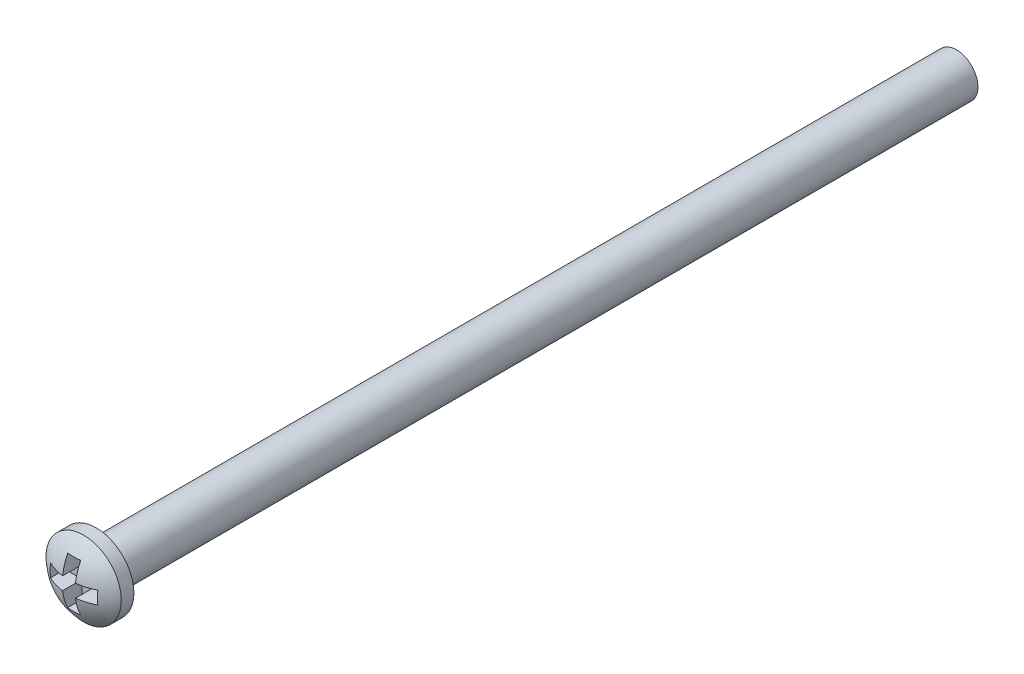
ISO-10303-21;
HEADER;
FILE_DESCRIPTION(('STEP AP214'),'2;1');
FILE_NAME('part.step','',(''),(''),'','','');
FILE_SCHEMA(('AUTOMOTIVE_DESIGN { 1 0 10303 214 1 1 1 1 }'));
ENDSEC;
DATA;
#1=APPLICATION_CONTEXT('core data for automotive mechanical design processes');
#2=APPLICATION_PROTOCOL_DEFINITION('international standard','automotive_design',2000,#1);
#3=PRODUCT_CONTEXT('',#1,'mechanical');
#4=PRODUCT('Part','Part','',(#3));
#5=PRODUCT_RELATED_PRODUCT_CATEGORY('part','',(#4));
#6=PRODUCT_DEFINITION_FORMATION('','',#4);
#7=PRODUCT_DEFINITION_CONTEXT('part definition',#1,'design');
#8=PRODUCT_DEFINITION('design','',#6,#7);
#9=PRODUCT_DEFINITION_SHAPE('','',#8);
#10=(LENGTH_UNIT() NAMED_UNIT(*) SI_UNIT(.MILLI.,.METRE.));
#11=(NAMED_UNIT(*) PLANE_ANGLE_UNIT() SI_UNIT($,.RADIAN.));
#12=(NAMED_UNIT(*) SI_UNIT($,.STERADIAN.) SOLID_ANGLE_UNIT());
#13=UNCERTAINTY_MEASURE_WITH_UNIT(LENGTH_MEASURE(1.E-05),#10,'distance_accuracy_value','');
#14=(GEOMETRIC_REPRESENTATION_CONTEXT(3) GLOBAL_UNCERTAINTY_ASSIGNED_CONTEXT((#13)) GLOBAL_UNIT_ASSIGNED_CONTEXT((#10,
#11,#12)) REPRESENTATION_CONTEXT('',''));
#15=CARTESIAN_POINT('',(0.,0.,0.));
#16=DIRECTION('',(0.,0.,1.));
#17=DIRECTION('',(1.,0.,0.));
#18=AXIS2_PLACEMENT_3D('',#15,#16,#17);
#19=CARTESIAN_POINT('',(0.,0.,-40.));
#20=DIRECTION('',(0.,0.,1.));
#21=DIRECTION('',(1.,0.,0.));
#22=AXIS2_PLACEMENT_3D('',#19,#20,#21);
#23=CYLINDRICAL_SURFACE('',#22,1.);
#24=CARTESIAN_POINT('',(0.,0.,-40.));
#25=DIRECTION('',(0.,0.,1.));
#26=DIRECTION('',(1.,0.,0.));
#27=AXIS2_PLACEMENT_3D('',#24,#25,#26);
#28=CIRCLE('',#27,1.);
#29=CARTESIAN_POINT('',(1.,0.,-40.));
#30=VERTEX_POINT('',#29);
#31=EDGE_CURVE('E212',#30,#30,#28,.T.);
#32=ORIENTED_EDGE('',*,*,#31,.T.);
#33=EDGE_LOOP('',(#32));
#34=FACE_BOUND('',#33,.T.);
#35=CARTESIAN_POINT('',(0.,0.,0.));
#36=DIRECTION('',(0.,0.,1.));
#37=DIRECTION('',(1.,0.,0.));
#38=AXIS2_PLACEMENT_3D('',#35,#36,#37);
#39=CIRCLE('',#38,1.);
#40=CARTESIAN_POINT('',(1.,0.,0.));
#41=VERTEX_POINT('',#40);
#42=EDGE_CURVE('E208',#41,#41,#39,.T.);
#43=ORIENTED_EDGE('',*,*,#42,.F.);
#44=EDGE_LOOP('',(#43));
#45=FACE_BOUND('',#44,.T.);
#46=ADVANCED_FACE('F41',(#34,#45),#23,.T.);
#47=CARTESIAN_POINT('',(0.,0.,-40.));
#48=DIRECTION('',(0.,0.,1.));
#49=DIRECTION('',(1.,0.,0.));
#50=AXIS2_PLACEMENT_3D('',#47,#48,#49);
#51=PLANE('',#50);
#52=ORIENTED_EDGE('',*,*,#31,.F.);
#53=EDGE_LOOP('',(#52));
#54=FACE_BOUND('',#53,.T.);
#55=ADVANCED_FACE('F281',(#54),#51,.F.);
#56=CARTESIAN_POINT('',(0.,0.,0.));
#57=DIRECTION('',(0.,0.,1.));
#58=DIRECTION('',(1.,0.,0.));
#59=AXIS2_PLACEMENT_3D('',#56,#57,#58);
#60=PLANE('',#59);
#61=ORIENTED_EDGE('',*,*,#42,.T.);
#62=EDGE_LOOP('',(#61));
#63=FACE_BOUND('',#62,.T.);
#64=CARTESIAN_POINT('',(0.,0.,0.));
#65=DIRECTION('',(0.,0.,-1.));
#66=DIRECTION('',(-1.,0.,0.));
#67=AXIS2_PLACEMENT_3D('',#64,#65,#66);
#68=CIRCLE('',#67,1.75);
#69=CARTESIAN_POINT('',(-1.75,0.,0.));
#70=VERTEX_POINT('',#69);
#71=EDGE_CURVE('E210',#70,#70,#68,.T.);
#72=ORIENTED_EDGE('',*,*,#71,.T.);
#73=EDGE_LOOP('',(#72));
#74=FACE_BOUND('',#73,.T.);
#75=ADVANCED_FACE('F286',(#63,#74),#60,.F.);
#76=CARTESIAN_POINT('',(0.,0.,-2.));
#77=DIRECTION('',(0.,0.,-1.));
#78=DIRECTION('',(-1.,0.,0.));
#79=AXIS2_PLACEMENT_3D('',#76,#77,#78);
#80=CYLINDRICAL_SURFACE('',#79,1.75);
#81=ORIENTED_EDGE('',*,*,#71,.F.);
#82=EDGE_LOOP('',(#81));
#83=FACE_BOUND('',#82,.T.);
#84=CARTESIAN_POINT('',(0.,0.,0.585357107135713));
#85=DIRECTION('',(0.,0.,-1.));
#86=DIRECTION('',(-1.,0.,0.));
#87=AXIS2_PLACEMENT_3D('',#84,#85,#86);
#88=CIRCLE('',#87,1.75);
#89=CARTESIAN_POINT('',(-1.75,0.,0.585357107135713));
#90=VERTEX_POINT('',#89);
#91=EDGE_CURVE('E180',#90,#90,#88,.T.);
#92=ORIENTED_EDGE('',*,*,#91,.T.);
#93=EDGE_LOOP('',(#92));
#94=FACE_BOUND('',#93,.T.);
#95=ADVANCED_FACE('F300',(#83,#94),#80,.T.);
#96=CARTESIAN_POINT('',(0.,0.,-1.2));
#97=DIRECTION('',(0.,0.,-1.));
#98=DIRECTION('',(1.,0.,0.));
#99=AXIS2_PLACEMENT_3D('',#96,#97,#98);
#100=SPHERICAL_SURFACE('',#99,2.5);
#101=CARTESIAN_POINT('',(0.,-1.1,-1.2));
#102=DIRECTION('',(0.,-1.,0.));
#103=DIRECTION('',(0.,0.,-1.));
#104=AXIS2_PLACEMENT_3D('',#101,#102,#103);
#105=CIRCLE('',#104,2.24499443206437);
#106=CARTESIAN_POINT('',(0.3,-1.1,1.0248595461287));
#107=VERTEX_POINT('',#106);
#108=CARTESIAN_POINT('',(-0.3,-1.1,1.0248595461287));
#109=VERTEX_POINT('',#108);
#110=EDGE_CURVE('E211',#107,#109,#105,.T.);
#111=ORIENTED_EDGE('',*,*,#110,.T.);
#112=CARTESIAN_POINT('',(-0.3,0.,-1.2));
#113=DIRECTION('',(-1.,0.,0.));
#114=DIRECTION('',(0.,0.,1.));
#115=AXIS2_PLACEMENT_3D('',#112,#113,#114);
#116=CIRCLE('',#115,2.48193472919818);
#117=CARTESIAN_POINT('',(-0.3,-0.3,1.26373699895098));
#118=VERTEX_POINT('',#117);
#119=EDGE_CURVE('E11',#109,#118,#116,.T.);
#120=ORIENTED_EDGE('',*,*,#119,.T.);
#121=CARTESIAN_POINT('',(0.,-0.3,-1.2));
#122=DIRECTION('',(0.,-1.,0.));
#123=DIRECTION('',(0.,0.,-1.));
#124=AXIS2_PLACEMENT_3D('',#121,#122,#123);
#125=CIRCLE('',#124,2.48193472919818);
#126=CARTESIAN_POINT('',(-1.1,-0.3,1.0248595461287));
#127=VERTEX_POINT('',#126);
#128=EDGE_CURVE('E48',#118,#127,#125,.T.);
#129=ORIENTED_EDGE('',*,*,#128,.T.);
#130=CARTESIAN_POINT('',(-1.1,0.,-1.2));
#131=DIRECTION('',(-1.,0.,0.));
#132=DIRECTION('',(0.,0.,1.));
#133=AXIS2_PLACEMENT_3D('',#130,#131,#132);
#134=CIRCLE('',#133,2.24499443206437);
#135=CARTESIAN_POINT('',(-1.1,0.3,1.0248595461287));
#136=VERTEX_POINT('',#135);
#137=EDGE_CURVE('E245',#127,#136,#134,.T.);
#138=ORIENTED_EDGE('',*,*,#137,.T.);
#139=CARTESIAN_POINT('',(0.,0.3,-1.2));
#140=DIRECTION('',(0.,1.,0.));
#141=DIRECTION('',(0.,0.,1.));
#142=AXIS2_PLACEMENT_3D('',#139,#140,#141);
#143=CIRCLE('',#142,2.48193472919818);
#144=CARTESIAN_POINT('',(-0.3,0.3,1.26373699895098));
#145=VERTEX_POINT('',#144);
#146=EDGE_CURVE('E236',#136,#145,#143,.T.);
#147=ORIENTED_EDGE('',*,*,#146,.T.);
#148=CARTESIAN_POINT('',(-0.3,0.,-1.2));
#149=DIRECTION('',(-1.,0.,0.));
#150=DIRECTION('',(0.,0.,1.));
#151=AXIS2_PLACEMENT_3D('',#148,#149,#150);
#152=CIRCLE('',#151,2.48193472919818);
#153=CARTESIAN_POINT('',(-0.3,1.1,1.0248595461287));
#154=VERTEX_POINT('',#153);
#155=EDGE_CURVE('E237',#145,#154,#152,.T.);
#156=ORIENTED_EDGE('',*,*,#155,.T.);
#157=CARTESIAN_POINT('',(0.,1.1,-1.2));
#158=DIRECTION('',(0.,1.,0.));
#159=DIRECTION('',(0.,0.,1.));
#160=AXIS2_PLACEMENT_3D('',#157,#158,#159);
#161=CIRCLE('',#160,2.24499443206437);
#162=CARTESIAN_POINT('',(0.3,1.1,1.0248595461287));
#163=VERTEX_POINT('',#162);
#164=EDGE_CURVE('E231',#154,#163,#161,.T.);
#165=ORIENTED_EDGE('',*,*,#164,.T.);
#166=CARTESIAN_POINT('',(0.3,0.,-1.2));
#167=DIRECTION('',(1.,0.,0.));
#168=DIRECTION('',(0.,0.,-1.));
#169=AXIS2_PLACEMENT_3D('',#166,#167,#168);
#170=CIRCLE('',#169,2.48193472919818);
#171=CARTESIAN_POINT('',(0.3,0.3,1.26373699895098));
#172=VERTEX_POINT('',#171);
#173=EDGE_CURVE('E228',#163,#172,#170,.T.);
#174=ORIENTED_EDGE('',*,*,#173,.T.);
#175=CARTESIAN_POINT('',(0.,0.3,-1.2));
#176=DIRECTION('',(0.,1.,0.));
#177=DIRECTION('',(0.,0.,1.));
#178=AXIS2_PLACEMENT_3D('',#175,#176,#177);
#179=CIRCLE('',#178,2.48193472919818);
#180=CARTESIAN_POINT('',(1.1,0.3,1.0248595461287));
#181=VERTEX_POINT('',#180);
#182=EDGE_CURVE('E230',#172,#181,#179,.T.);
#183=ORIENTED_EDGE('',*,*,#182,.T.);
#184=CARTESIAN_POINT('',(1.1,0.,-1.2));
#185=DIRECTION('',(1.,0.,0.));
#186=DIRECTION('',(0.,0.,-1.));
#187=AXIS2_PLACEMENT_3D('',#184,#185,#186);
#188=CIRCLE('',#187,2.24499443206437);
#189=CARTESIAN_POINT('',(1.1,-0.3,1.0248595461287));
#190=VERTEX_POINT('',#189);
#191=EDGE_CURVE('E224',#181,#190,#188,.T.);
#192=ORIENTED_EDGE('',*,*,#191,.T.);
#193=CARTESIAN_POINT('',(0.,-0.3,-1.2));
#194=DIRECTION('',(0.,-1.,0.));
#195=DIRECTION('',(0.,0.,-1.));
#196=AXIS2_PLACEMENT_3D('',#193,#194,#195);
#197=CIRCLE('',#196,2.48193472919818);
#198=CARTESIAN_POINT('',(0.3,-0.3,1.26373699895098));
#199=VERTEX_POINT('',#198);
#200=EDGE_CURVE('E223',#190,#199,#197,.T.);
#201=ORIENTED_EDGE('',*,*,#200,.T.);
#202=CARTESIAN_POINT('',(0.3,0.,-1.2));
#203=DIRECTION('',(1.,0.,0.));
#204=DIRECTION('',(0.,0.,-1.));
#205=AXIS2_PLACEMENT_3D('',#202,#203,#204);
#206=CIRCLE('',#205,2.48193472919818);
#207=EDGE_CURVE('E219',#199,#107,#206,.T.);
#208=ORIENTED_EDGE('',*,*,#207,.T.);
#209=EDGE_LOOP('',(#111,#120,#129,#138,#147,#156,#165,#174,#183,#192,#201,#208));
#210=FACE_BOUND('',#209,.T.);
#211=ORIENTED_EDGE('',*,*,#91,.F.);
#212=EDGE_LOOP('',(#211));
#213=FACE_BOUND('',#212,.T.);
#214=ADVANCED_FACE('F243',(#210,#213),#100,.T.);
#215=CARTESIAN_POINT('',(-0.3,-0.3,0.35));
#216=DIRECTION('',(-1.,0.,0.));
#217=DIRECTION('',(0.,0.,1.));
#218=AXIS2_PLACEMENT_3D('',#215,#216,#217);
#219=PLANE('',#218);
#220=DIRECTION('',(0.,0.,1.));
#221=VECTOR('',#220,1.);
#222=CARTESIAN_POINT('',(-0.3,-1.1,0.35));
#223=LINE('',#222,#221);
#224=CARTESIAN_POINT('',(-0.3,-1.1,0.35));
#225=VERTEX_POINT('',#224);
#226=EDGE_CURVE('E54',#225,#109,#223,.T.);
#227=ORIENTED_EDGE('',*,*,#226,.F.);
#228=DIRECTION('',(0.,-1.,0.));
#229=VECTOR('',#228,1.);
#230=CARTESIAN_POINT('',(-0.3,-0.3,0.35));
#231=LINE('',#230,#229);
#232=CARTESIAN_POINT('',(-0.3,-0.3,0.35));
#233=VERTEX_POINT('',#232);
#234=EDGE_CURVE('E129',#233,#225,#231,.T.);
#235=ORIENTED_EDGE('',*,*,#234,.F.);
#236=DIRECTION('',(0.,0.,1.));
#237=VECTOR('',#236,1.);
#238=CARTESIAN_POINT('',(-0.3,-0.3,0.35));
#239=LINE('',#238,#237);
#240=EDGE_CURVE('E172',#233,#118,#239,.T.);
#241=ORIENTED_EDGE('',*,*,#240,.T.);
#242=ORIENTED_EDGE('',*,*,#119,.F.);
#243=EDGE_LOOP('',(#227,#235,#241,#242));
#244=FACE_BOUND('',#243,.T.);
#245=ADVANCED_FACE('F127',(#244),#219,.F.);
#246=CARTESIAN_POINT('',(-1.1,-0.3,0.35));
#247=DIRECTION('',(0.,-1.,0.));
#248=DIRECTION('',(0.,0.,-1.));
#249=AXIS2_PLACEMENT_3D('',#246,#247,#248);
#250=PLANE('',#249);
#251=ORIENTED_EDGE('',*,*,#240,.F.);
#252=DIRECTION('',(1.,0.,0.));
#253=VECTOR('',#252,1.);
#254=CARTESIAN_POINT('',(-1.1,-0.3,0.35));
#255=LINE('',#254,#253);
#256=CARTESIAN_POINT('',(-1.1,-0.3,0.35));
#257=VERTEX_POINT('',#256);
#258=EDGE_CURVE('E131',#257,#233,#255,.T.);
#259=ORIENTED_EDGE('',*,*,#258,.F.);
#260=DIRECTION('',(0.,0.,1.));
#261=VECTOR('',#260,1.);
#262=CARTESIAN_POINT('',(-1.1,-0.3,0.35));
#263=LINE('',#262,#261);
#264=EDGE_CURVE('E179',#257,#127,#263,.T.);
#265=ORIENTED_EDGE('',*,*,#264,.T.);
#266=ORIENTED_EDGE('',*,*,#128,.F.);
#267=EDGE_LOOP('',(#251,#259,#265,#266));
#268=FACE_BOUND('',#267,.T.);
#269=ADVANCED_FACE('F273',(#268),#250,.F.);
#270=CARTESIAN_POINT('',(-1.1,0.3,0.35));
#271=DIRECTION('',(-1.,0.,0.));
#272=DIRECTION('',(0.,0.,1.));
#273=AXIS2_PLACEMENT_3D('',#270,#271,#272);
#274=PLANE('',#273);
#275=ORIENTED_EDGE('',*,*,#264,.F.);
#276=DIRECTION('',(0.,-1.,0.));
#277=VECTOR('',#276,1.);
#278=CARTESIAN_POINT('',(-1.1,0.3,0.35));
#279=LINE('',#278,#277);
#280=CARTESIAN_POINT('',(-1.1,0.3,0.35));
#281=VERTEX_POINT('',#280);
#282=EDGE_CURVE('E175',#281,#257,#279,.T.);
#283=ORIENTED_EDGE('',*,*,#282,.F.);
#284=DIRECTION('',(0.,0.,1.));
#285=VECTOR('',#284,1.);
#286=CARTESIAN_POINT('',(-1.1,0.3,0.35));
#287=LINE('',#286,#285);
#288=EDGE_CURVE('E178',#281,#136,#287,.T.);
#289=ORIENTED_EDGE('',*,*,#288,.T.);
#290=ORIENTED_EDGE('',*,*,#137,.F.);
#291=EDGE_LOOP('',(#275,#283,#289,#290));
#292=FACE_BOUND('',#291,.T.);
#293=ADVANCED_FACE('F275',(#292),#274,.F.);
#294=CARTESIAN_POINT('',(-0.3,0.3,0.35));
#295=DIRECTION('',(0.,1.,0.));
#296=DIRECTION('',(0.,0.,1.));
#297=AXIS2_PLACEMENT_3D('',#294,#295,#296);
#298=PLANE('',#297);
#299=ORIENTED_EDGE('',*,*,#288,.F.);
#300=DIRECTION('',(-1.,0.,0.));
#301=VECTOR('',#300,1.);
#302=CARTESIAN_POINT('',(-0.3,0.3,0.35));
#303=LINE('',#302,#301);
#304=CARTESIAN_POINT('',(-0.3,0.3,0.35));
#305=VERTEX_POINT('',#304);
#306=EDGE_CURVE('E166',#305,#281,#303,.T.);
#307=ORIENTED_EDGE('',*,*,#306,.F.);
#308=DIRECTION('',(0.,0.,1.));
#309=VECTOR('',#308,1.);
#310=CARTESIAN_POINT('',(-0.3,0.3,0.35));
#311=LINE('',#310,#309);
#312=EDGE_CURVE('E181',#305,#145,#311,.T.);
#313=ORIENTED_EDGE('',*,*,#312,.T.);
#314=ORIENTED_EDGE('',*,*,#146,.F.);
#315=EDGE_LOOP('',(#299,#307,#313,#314));
#316=FACE_BOUND('',#315,.T.);
#317=ADVANCED_FACE('F269',(#316),#298,.F.);
#318=CARTESIAN_POINT('',(-0.3,1.1,0.35));
#319=DIRECTION('',(-1.,0.,0.));
#320=DIRECTION('',(0.,0.,1.));
#321=AXIS2_PLACEMENT_3D('',#318,#319,#320);
#322=PLANE('',#321);
#323=ORIENTED_EDGE('',*,*,#312,.F.);
#324=DIRECTION('',(0.,-1.,0.));
#325=VECTOR('',#324,1.);
#326=CARTESIAN_POINT('',(-0.3,1.1,0.35));
#327=LINE('',#326,#325);
#328=CARTESIAN_POINT('',(-0.3,1.1,0.35));
#329=VERTEX_POINT('',#328);
#330=EDGE_CURVE('E167',#329,#305,#327,.T.);
#331=ORIENTED_EDGE('',*,*,#330,.F.);
#332=DIRECTION('',(0.,0.,1.));
#333=VECTOR('',#332,1.);
#334=CARTESIAN_POINT('',(-0.3,1.1,0.35));
#335=LINE('',#334,#333);
#336=EDGE_CURVE('E188',#329,#154,#335,.T.);
#337=ORIENTED_EDGE('',*,*,#336,.T.);
#338=ORIENTED_EDGE('',*,*,#155,.F.);
#339=EDGE_LOOP('',(#323,#331,#337,#338));
#340=FACE_BOUND('',#339,.T.);
#341=ADVANCED_FACE('F266',(#340),#322,.F.);
#342=CARTESIAN_POINT('',(0.3,1.1,0.35));
#343=DIRECTION('',(0.,1.,0.));
#344=DIRECTION('',(0.,0.,1.));
#345=AXIS2_PLACEMENT_3D('',#342,#343,#344);
#346=PLANE('',#345);
#347=ORIENTED_EDGE('',*,*,#336,.F.);
#348=DIRECTION('',(-1.,0.,0.));
#349=VECTOR('',#348,1.);
#350=CARTESIAN_POINT('',(0.3,1.1,0.35));
#351=LINE('',#350,#349);
#352=CARTESIAN_POINT('',(0.3,1.1,0.35));
#353=VERTEX_POINT('',#352);
#354=EDGE_CURVE('E164',#353,#329,#351,.T.);
#355=ORIENTED_EDGE('',*,*,#354,.F.);
#356=DIRECTION('',(0.,0.,1.));
#357=VECTOR('',#356,1.);
#358=CARTESIAN_POINT('',(0.3,1.1,0.35));
#359=LINE('',#358,#357);
#360=EDGE_CURVE('E189',#353,#163,#359,.T.);
#361=ORIENTED_EDGE('',*,*,#360,.T.);
#362=ORIENTED_EDGE('',*,*,#164,.F.);
#363=EDGE_LOOP('',(#347,#355,#361,#362));
#364=FACE_BOUND('',#363,.T.);
#365=ADVANCED_FACE('F261',(#364),#346,.F.);
#366=CARTESIAN_POINT('',(0.3,0.3,0.35));
#367=DIRECTION('',(1.,0.,0.));
#368=DIRECTION('',(0.,0.,-1.));
#369=AXIS2_PLACEMENT_3D('',#366,#367,#368);
#370=PLANE('',#369);
#371=ORIENTED_EDGE('',*,*,#360,.F.);
#372=DIRECTION('',(0.,1.,0.));
#373=VECTOR('',#372,1.);
#374=CARTESIAN_POINT('',(0.3,0.3,0.35));
#375=LINE('',#374,#373);
#376=CARTESIAN_POINT('',(0.3,0.3,0.35));
#377=VERTEX_POINT('',#376);
#378=EDGE_CURVE('E158',#377,#353,#375,.T.);
#379=ORIENTED_EDGE('',*,*,#378,.F.);
#380=DIRECTION('',(0.,0.,1.));
#381=VECTOR('',#380,1.);
#382=CARTESIAN_POINT('',(0.3,0.3,0.35));
#383=LINE('',#382,#381);
#384=EDGE_CURVE('E195',#377,#172,#383,.T.);
#385=ORIENTED_EDGE('',*,*,#384,.T.);
#386=ORIENTED_EDGE('',*,*,#173,.F.);
#387=EDGE_LOOP('',(#371,#379,#385,#386));
#388=FACE_BOUND('',#387,.T.);
#389=ADVANCED_FACE('F263',(#388),#370,.F.);
#390=CARTESIAN_POINT('',(1.1,0.3,0.35));
#391=DIRECTION('',(0.,1.,0.));
#392=DIRECTION('',(0.,0.,1.));
#393=AXIS2_PLACEMENT_3D('',#390,#391,#392);
#394=PLANE('',#393);
#395=ORIENTED_EDGE('',*,*,#384,.F.);
#396=DIRECTION('',(-1.,0.,0.));
#397=VECTOR('',#396,1.);
#398=CARTESIAN_POINT('',(1.1,0.3,0.35));
#399=LINE('',#398,#397);
#400=CARTESIAN_POINT('',(1.1,0.3,0.35));
#401=VERTEX_POINT('',#400);
#402=EDGE_CURVE('E160',#401,#377,#399,.T.);
#403=ORIENTED_EDGE('',*,*,#402,.F.);
#404=DIRECTION('',(0.,0.,1.));
#405=VECTOR('',#404,1.);
#406=CARTESIAN_POINT('',(1.1,0.3,0.35));
#407=LINE('',#406,#405);
#408=EDGE_CURVE('E194',#401,#181,#407,.T.);
#409=ORIENTED_EDGE('',*,*,#408,.T.);
#410=ORIENTED_EDGE('',*,*,#182,.F.);
#411=EDGE_LOOP('',(#395,#403,#409,#410));
#412=FACE_BOUND('',#411,.T.);
#413=ADVANCED_FACE('F257',(#412),#394,.F.);
#414=CARTESIAN_POINT('',(1.1,-0.3,0.35));
#415=DIRECTION('',(1.,0.,0.));
#416=DIRECTION('',(0.,0.,-1.));
#417=AXIS2_PLACEMENT_3D('',#414,#415,#416);
#418=PLANE('',#417);
#419=ORIENTED_EDGE('',*,*,#408,.F.);
#420=DIRECTION('',(0.,1.,0.));
#421=VECTOR('',#420,1.);
#422=CARTESIAN_POINT('',(1.1,-0.3,0.35));
#423=LINE('',#422,#421);
#424=CARTESIAN_POINT('',(1.1,-0.3,0.35));
#425=VERTEX_POINT('',#424);
#426=EDGE_CURVE('E151',#425,#401,#423,.T.);
#427=ORIENTED_EDGE('',*,*,#426,.F.);
#428=DIRECTION('',(0.,0.,1.));
#429=VECTOR('',#428,1.);
#430=CARTESIAN_POINT('',(1.1,-0.3,0.35));
#431=LINE('',#430,#429);
#432=EDGE_CURVE('E198',#425,#190,#431,.T.);
#433=ORIENTED_EDGE('',*,*,#432,.T.);
#434=ORIENTED_EDGE('',*,*,#191,.F.);
#435=EDGE_LOOP('',(#419,#427,#433,#434));
#436=FACE_BOUND('',#435,.T.);
#437=ADVANCED_FACE('F251',(#436),#418,.F.);
#438=CARTESIAN_POINT('',(0.3,-0.3,0.35));
#439=DIRECTION('',(0.,-1.,0.));
#440=DIRECTION('',(0.,0.,-1.));
#441=AXIS2_PLACEMENT_3D('',#438,#439,#440);
#442=PLANE('',#441);
#443=ORIENTED_EDGE('',*,*,#432,.F.);
#444=DIRECTION('',(1.,0.,0.));
#445=VECTOR('',#444,1.);
#446=CARTESIAN_POINT('',(0.3,-0.3,0.35));
#447=LINE('',#446,#445);
#448=CARTESIAN_POINT('',(0.3,-0.3,0.35));
#449=VERTEX_POINT('',#448);
#450=EDGE_CURVE('E152',#449,#425,#447,.T.);
#451=ORIENTED_EDGE('',*,*,#450,.F.);
#452=DIRECTION('',(0.,0.,1.));
#453=VECTOR('',#452,1.);
#454=CARTESIAN_POINT('',(0.3,-0.3,0.35));
#455=LINE('',#454,#453);
#456=EDGE_CURVE('E201',#449,#199,#455,.T.);
#457=ORIENTED_EDGE('',*,*,#456,.T.);
#458=ORIENTED_EDGE('',*,*,#200,.F.);
#459=EDGE_LOOP('',(#443,#451,#457,#458));
#460=FACE_BOUND('',#459,.T.);
#461=ADVANCED_FACE('F255',(#460),#442,.F.);
#462=CARTESIAN_POINT('',(0.3,-1.1,0.35));
#463=DIRECTION('',(1.,0.,0.));
#464=DIRECTION('',(0.,0.,-1.));
#465=AXIS2_PLACEMENT_3D('',#462,#463,#464);
#466=PLANE('',#465);
#467=ORIENTED_EDGE('',*,*,#456,.F.);
#468=DIRECTION('',(0.,1.,0.));
#469=VECTOR('',#468,1.);
#470=CARTESIAN_POINT('',(0.3,-1.1,0.35));
#471=LINE('',#470,#469);
#472=CARTESIAN_POINT('',(0.3,-1.1,0.35));
#473=VERTEX_POINT('',#472);
#474=EDGE_CURVE('E144',#473,#449,#471,.T.);
#475=ORIENTED_EDGE('',*,*,#474,.F.);
#476=DIRECTION('',(0.,0.,1.));
#477=VECTOR('',#476,1.);
#478=CARTESIAN_POINT('',(0.3,-1.1,0.35));
#479=LINE('',#478,#477);
#480=EDGE_CURVE('E134',#473,#107,#479,.T.);
#481=ORIENTED_EDGE('',*,*,#480,.T.);
#482=ORIENTED_EDGE('',*,*,#207,.F.);
#483=EDGE_LOOP('',(#467,#475,#481,#482));
#484=FACE_BOUND('',#483,.T.);
#485=ADVANCED_FACE('F246',(#484),#466,.F.);
#486=CARTESIAN_POINT('',(-0.3,-1.1,0.35));
#487=DIRECTION('',(0.,-1.,0.));
#488=DIRECTION('',(0.,0.,-1.));
#489=AXIS2_PLACEMENT_3D('',#486,#487,#488);
#490=PLANE('',#489);
#491=ORIENTED_EDGE('',*,*,#480,.F.);
#492=DIRECTION('',(1.,0.,0.));
#493=VECTOR('',#492,1.);
#494=CARTESIAN_POINT('',(-0.3,-1.1,0.35));
#495=LINE('',#494,#493);
#496=EDGE_CURVE('E140',#225,#473,#495,.T.);
#497=ORIENTED_EDGE('',*,*,#496,.F.);
#498=ORIENTED_EDGE('',*,*,#226,.T.);
#499=ORIENTED_EDGE('',*,*,#110,.F.);
#500=EDGE_LOOP('',(#491,#497,#498,#499));
#501=FACE_BOUND('',#500,.T.);
#502=ADVANCED_FACE('F139',(#501),#490,.F.);
#503=CARTESIAN_POINT('',(0.,0.,0.35));
#504=DIRECTION('',(0.,0.,1.));
#505=DIRECTION('',(1.,0.,0.));
#506=AXIS2_PLACEMENT_3D('',#503,#504,#505);
#507=PLANE('',#506);
#508=ORIENTED_EDGE('',*,*,#234,.T.);
#509=ORIENTED_EDGE('',*,*,#496,.T.);
#510=ORIENTED_EDGE('',*,*,#474,.T.);
#511=ORIENTED_EDGE('',*,*,#450,.T.);
#512=ORIENTED_EDGE('',*,*,#426,.T.);
#513=ORIENTED_EDGE('',*,*,#402,.T.);
#514=ORIENTED_EDGE('',*,*,#378,.T.);
#515=ORIENTED_EDGE('',*,*,#354,.T.);
#516=ORIENTED_EDGE('',*,*,#330,.T.);
#517=ORIENTED_EDGE('',*,*,#306,.T.);
#518=ORIENTED_EDGE('',*,*,#282,.T.);
#519=ORIENTED_EDGE('',*,*,#258,.T.);
#520=EDGE_LOOP('',(#508,#509,#510,#511,#512,#513,#514,#515,#516,#517,#518,#519));
#521=FACE_BOUND('',#520,.T.);
#522=ADVANCED_FACE('F143',(#521),#507,.T.);
#523=CLOSED_SHELL('',(#46,#55,#75,#95,#214,#245,#269,#293,#317,#341,#365,#389,#413,#437,#461,
#485,#502,#522));
#524=MANIFOLD_SOLID_BREP('B2',#523);
#525=ADVANCED_BREP_SHAPE_REPRESENTATION('',(#18,#524),#14);
#526=SHAPE_DEFINITION_REPRESENTATION(#9,#525);
ENDSEC;
END-ISO-10303-21;
